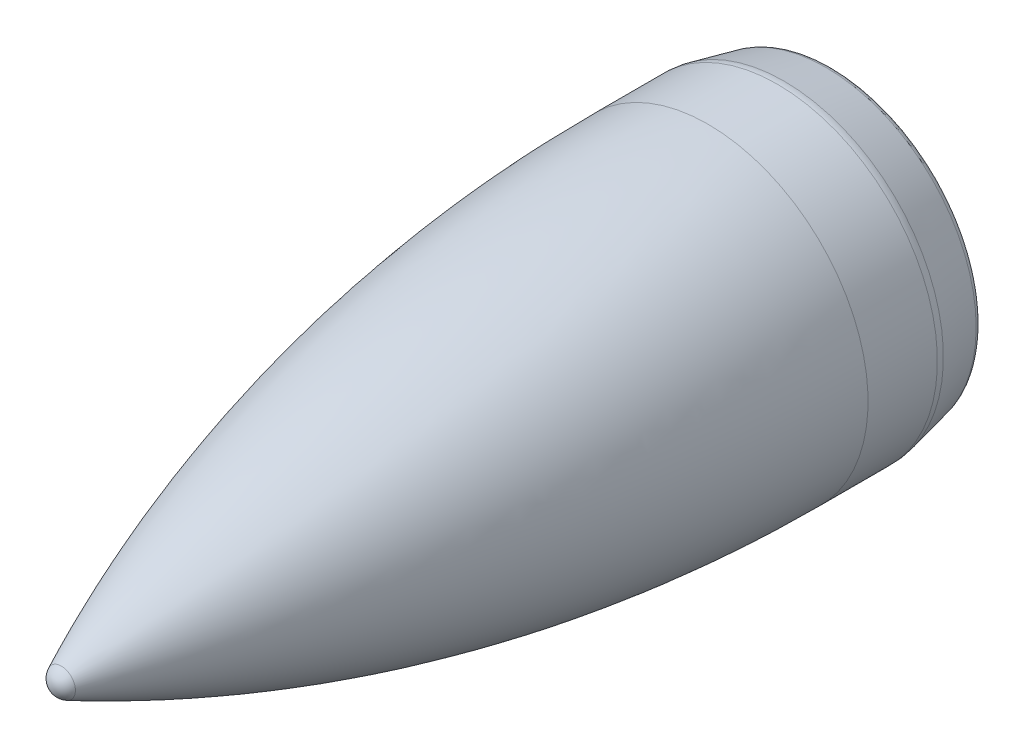
ISO-10303-21;
HEADER;
FILE_DESCRIPTION(('STEP AP214'),'2;1');
FILE_NAME('part.step','',(''),(''),'','','');
FILE_SCHEMA(('AUTOMOTIVE_DESIGN { 1 0 10303 214 1 1 1 1 }'));
ENDSEC;
DATA;
#1=APPLICATION_CONTEXT('core data for automotive mechanical design processes');
#2=APPLICATION_PROTOCOL_DEFINITION('international standard','automotive_design',2000,#1);
#3=PRODUCT_CONTEXT('',#1,'mechanical');
#4=PRODUCT('Part','Part','',(#3));
#5=PRODUCT_RELATED_PRODUCT_CATEGORY('part','',(#4));
#6=PRODUCT_DEFINITION_FORMATION('','',#4);
#7=PRODUCT_DEFINITION_CONTEXT('part definition',#1,'design');
#8=PRODUCT_DEFINITION('design','',#6,#7);
#9=PRODUCT_DEFINITION_SHAPE('','',#8);
#10=(LENGTH_UNIT() NAMED_UNIT(*) SI_UNIT(.MILLI.,.METRE.));
#11=(NAMED_UNIT(*) PLANE_ANGLE_UNIT() SI_UNIT($,.RADIAN.));
#12=(NAMED_UNIT(*) SI_UNIT($,.STERADIAN.) SOLID_ANGLE_UNIT());
#13=UNCERTAINTY_MEASURE_WITH_UNIT(LENGTH_MEASURE(1.E-05),#10,'distance_accuracy_value','');
#14=(GEOMETRIC_REPRESENTATION_CONTEXT(3) GLOBAL_UNCERTAINTY_ASSIGNED_CONTEXT((#13)) GLOBAL_UNIT_ASSIGNED_CONTEXT((#10,
#11,#12)) REPRESENTATION_CONTEXT('',''));
#15=CARTESIAN_POINT('',(0.,0.,0.));
#16=DIRECTION('',(0.,0.,1.));
#17=DIRECTION('',(1.,0.,0.));
#18=AXIS2_PLACEMENT_3D('',#15,#16,#17);
#19=CARTESIAN_POINT('',(0.,3.4669625365838,-3.048));
#20=DIRECTION('',(0.,0.,1.));
#21=DIRECTION('',(0.,-1.,0.));
#22=AXIS2_PLACEMENT_3D('',#19,#20,#21);
#23=PLANE('',#22);
#24=CARTESIAN_POINT('',(0.,0.,-3.048));
#25=DIRECTION('',(0.,0.,1.));
#26=DIRECTION('',(0.,-1.,0.));
#27=AXIS2_PLACEMENT_3D('',#24,#25,#26);
#28=CIRCLE('',#27,3.4669625365838);
#29=CARTESIAN_POINT('',(0.,-3.4669625365838,-3.048));
#30=VERTEX_POINT('',#29);
#31=EDGE_CURVE('E72',#30,#30,#28,.T.);
#32=ORIENTED_EDGE('',*,*,#31,.F.);
#33=EDGE_LOOP('',(#32));
#34=FACE_BOUND('',#33,.T.);
#35=ADVANCED_FACE('F45',(#34),#23,.F.);
#36=CARTESIAN_POINT('',(0.,0.,15.6424081157519));
#37=DIRECTION('',(0.,0.,1.));
#38=DIRECTION('',(0.,1.,0.));
#39=AXIS2_PLACEMENT_3D('',#36,#37,#38);
#40=SPHERICAL_SURFACE('',#39,0.381);
#41=CARTESIAN_POINT('',(0.,0.,15.8060597916501));
#42=DIRECTION('',(0.,0.,1.));
#43=DIRECTION('',(0.,-1.,0.));
#44=AXIS2_PLACEMENT_3D('',#41,#42,#43);
#45=CIRCLE('',#44,0.344062681753926);
#46=CARTESIAN_POINT('',(0.,-0.344062681753928,15.8060597916501));
#47=VERTEX_POINT('',#46);
#48=EDGE_CURVE('E10',#47,#47,#45,.T.);
#49=ORIENTED_EDGE('',*,*,#48,.T.);
#50=EDGE_LOOP('',(#49));
#51=FACE_BOUND('',#50,.T.);
#52=ADVANCED_FACE('F87',(#51),#40,.T.);
#53=CARTESIAN_POINT('',(0.,3.91160000000013,6.05015734739382E-13));
#54=CARTESIAN_POINT('',(0.,3.91160000000013,0.0812817513316196));
#55=CARTESIAN_POINT('',(0.,3.91091466438922,0.243605202599734));
#56=CARTESIAN_POINT('',(0.,3.90783055201546,0.630224140604456));
#57=CARTESIAN_POINT('',(0.,3.89960771190493,0.944858140157725));
#58=CARTESIAN_POINT('',(0.,3.8872727329805,1.37751376906593));
#59=CARTESIAN_POINT('',(0.,3.87083138847377,1.74024603751147));
#60=CARTESIAN_POINT('',(0.,3.85027803492917,2.14364851709325));
#61=CARTESIAN_POINT('',(0.,3.82562704849102,2.52389536090649));
#62=CARTESIAN_POINT('',(0.,3.78967242501598,3.01298358565161));
#63=CARTESIAN_POINT('',(0.,3.73835054552011,3.59163085105274));
#64=CARTESIAN_POINT('',(0.,3.66649915250978,4.2702846931654));
#65=CARTESIAN_POINT('',(0.,3.56810160041941,5.04102824095544));
#66=CARTESIAN_POINT('',(0.,3.45333156468382,5.81121913305999));
#67=CARTESIAN_POINT('',(0.,3.32244170431367,6.57765968896453));
#68=CARTESIAN_POINT('',(0.,3.17517102067353,7.3421115851912));
#69=CARTESIAN_POINT('',(0.,3.01210390037676,8.10228100950946));
#70=CARTESIAN_POINT('',(0.,2.83246443577178,8.86013494284682));
#71=CARTESIAN_POINT('',(0.,2.63772658119155,9.61208743196429));
#72=CARTESIAN_POINT('',(0.,2.42568625628858,10.3628120157683));
#73=CARTESIAN_POINT('',(0.,2.20020738855557,11.1039316440157));
#74=CARTESIAN_POINT('',(0.,1.95518414687195,11.8482353007995));
#75=CARTESIAN_POINT('',(0.,1.70097099452093,12.5738076472831));
#76=CARTESIAN_POINT('',(0.,1.42065083354641,13.3161566754205));
#77=CARTESIAN_POINT('',(0.,1.14325402913666,14.0141635847247));
#78=CARTESIAN_POINT('',(0.,0.857658132748848,14.6816008528812));
#79=CARTESIAN_POINT('',(0.,0.65094490609983,15.1496991334785));
#80=CARTESIAN_POINT('',(0.,0.447397481816125,15.5872122995511));
#81=CARTESIAN_POINT('',(0.,0.378975814642762,15.7326581227743));
#82=CARTESIAN_POINT('',(0.,0.344062681780408,15.8060597915944));
#83=B_SPLINE_CURVE_WITH_KNOTS('',4,(#53,#54,#55,#56,#57,#58,#59,#60,#61,#62,#63,#64,#65,#66,#67,
#68,#69,#70,#71,#72,#73,#74,#75,#76,#77,#78,#79,#80,#81,#82),.UNSPECIFIED.,.F.,.F.,(5,1,1,1,1,1,
1,1,1,1,1,1,1,1,1,1,1,1,1,1,1,1,1,1,1,1,5),(0.0832846360657686,0.103185271976087,
0.123085907886406,0.142986543872432,0.162887179858458,0.182787816535228,0.202688453211998,
0.222589089077083,0.242489724942169,0.282290995036511,0.322092269878615,0.361893549077468,
0.401694812600632,0.441496078337045,0.481297362993973,0.521098634198775,0.560899896884632,
0.600701175601061,0.640502451348722,0.680303710861297,0.720104976164637,0.759906270639483,
0.799707548202696,0.839508792738012,0.879310081738808,0.899210730808644,0.919111379878479),.UNSPECIFIED.);
#84=CARTESIAN_POINT('',(0.,0.,16.0234081157519));
#85=DIRECTION('',(0.,0.,1.));
#86=AXIS1_PLACEMENT('',#84,#85);
#87=SURFACE_OF_REVOLUTION('',#83,#86);
#88=ORIENTED_EDGE('',*,*,#48,.F.);
#89=EDGE_LOOP('',(#88));
#90=FACE_BOUND('',#89,.T.);
#91=CARTESIAN_POINT('',(0.,0.,6.03683769639929E-13));
#92=DIRECTION('',(0.,0.,1.));
#93=DIRECTION('',(0.,-1.,0.));
#94=AXIS2_PLACEMENT_3D('',#91,#92,#93);
#95=CIRCLE('',#94,3.91160000000013);
#96=CARTESIAN_POINT('',(0.,-3.91160000000013,6.0320415807182E-13));
#97=VERTEX_POINT('',#96);
#98=EDGE_CURVE('E52',#97,#97,#95,.T.);
#99=ORIENTED_EDGE('',*,*,#98,.T.);
#100=EDGE_LOOP('',(#99));
#101=FACE_BOUND('',#100,.T.);
#102=ADVANCED_FACE('F83',(#90,#101),#87,.T.);
#103=CARTESIAN_POINT('',(0.,0.,16.0234081157519));
#104=DIRECTION('',(0.,0.,1.));
#105=DIRECTION('',(0.,-1.,0.));
#106=AXIS2_PLACEMENT_3D('',#103,#104,#105);
#107=CYLINDRICAL_SURFACE('',#106,3.91160000000006);
#108=ORIENTED_EDGE('',*,*,#98,.F.);
#109=EDGE_LOOP('',(#108));
#110=FACE_BOUND('',#109,.T.);
#111=CARTESIAN_POINT('',(0.,0.,-1.69454742749737));
#112=DIRECTION('',(0.,0.,1.));
#113=DIRECTION('',(0.,-1.,0.));
#114=AXIS2_PLACEMENT_3D('',#111,#112,#113);
#115=CIRCLE('',#114,3.9116);
#116=CARTESIAN_POINT('',(0.,-3.9116,-1.69454742749737));
#117=VERTEX_POINT('',#116);
#118=EDGE_CURVE('E57',#117,#117,#115,.T.);
#119=ORIENTED_EDGE('',*,*,#118,.T.);
#120=EDGE_LOOP('',(#119));
#121=FACE_BOUND('',#120,.T.);
#122=ADVANCED_FACE('F86',(#110,#121),#107,.T.);
#123=CARTESIAN_POINT('',(0.,0.,-1.69454742749737));
#124=DIRECTION('',(0.,0.,1.));
#125=DIRECTION('',(0.,-1.,0.));
#126=AXIS2_PLACEMENT_3D('',#123,#124,#125);
#127=TOROIDAL_SURFACE('',#126,3.1496,0.762000000000001);
#128=ORIENTED_EDGE('',*,*,#118,.F.);
#129=EDGE_LOOP('',(#128));
#130=FACE_BOUND('',#129,.T.);
#131=CARTESIAN_POINT('',(0.,0.,-1.85947441331821));
#132=DIRECTION('',(0.,0.,1.));
#133=DIRECTION('',(0.,-1.,0.));
#134=AXIS2_PLACEMENT_3D('',#131,#132,#133);
#135=CIRCLE('',#134,3.89353755742539);
#136=CARTESIAN_POINT('',(0.,-3.89353755742539,-1.85947441331821));
#137=VERTEX_POINT('',#136);
#138=EDGE_CURVE('E62',#137,#137,#135,.T.);
#139=ORIENTED_EDGE('',*,*,#138,.T.);
#140=EDGE_LOOP('',(#139));
#141=FACE_BOUND('',#140,.T.);
#142=ADVANCED_FACE('F107',(#130,#141),#127,.T.);
#143=CARTESIAN_POINT('',(0.,0.,-2.88878052955222));
#144=DIRECTION('',(0.,0.,1.));
#145=DIRECTION('',(0.,-1.,0.));
#146=AXIS2_PLACEMENT_3D('',#143,#144,#145);
#147=CONICAL_SURFACE('',#146,3.66534588523057,0.218166156499292);
#148=ORIENTED_EDGE('',*,*,#138,.F.);
#149=EDGE_LOOP('',(#148));
#150=FACE_BOUND('',#149,.T.);
#151=CARTESIAN_POINT('',(0.,0.,-2.88878052955222));
#152=DIRECTION('',(0.,0.,1.));
#153=DIRECTION('',(0.,-1.,0.));
#154=AXIS2_PLACEMENT_3D('',#151,#152,#153);
#155=CIRCLE('',#154,3.66534588523057);
#156=CARTESIAN_POINT('',(0.,-3.66534588523057,-2.88878052955222));
#157=VERTEX_POINT('',#156);
#158=EDGE_CURVE('E68',#157,#157,#155,.T.);
#159=ORIENTED_EDGE('',*,*,#158,.T.);
#160=EDGE_LOOP('',(#159));
#161=FACE_BOUND('',#160,.T.);
#162=ADVANCED_FACE('F101',(#150,#161),#147,.T.);
#163=CARTESIAN_POINT('',(0.,0.,-2.8448));
#164=DIRECTION('',(0.,0.,1.));
#165=DIRECTION('',(0.,-1.,0.));
#166=AXIS2_PLACEMENT_3D('',#163,#164,#165);
#167=TOROIDAL_SURFACE('',#166,3.4669625365838,0.203200000000001);
#168=ORIENTED_EDGE('',*,*,#158,.F.);
#169=EDGE_LOOP('',(#168));
#170=FACE_BOUND('',#169,.T.);
#171=ORIENTED_EDGE('',*,*,#31,.T.);
#172=EDGE_LOOP('',(#171));
#173=FACE_BOUND('',#172,.T.);
#174=ADVANCED_FACE('F99',(#170,#173),#167,.T.);
#175=CLOSED_SHELL('',(#35,#52,#102,#122,#142,#162,#174));
#176=MANIFOLD_SOLID_BREP('B2',#175);
#177=ADVANCED_BREP_SHAPE_REPRESENTATION('',(#18,#176),#14);
#178=SHAPE_DEFINITION_REPRESENTATION(#9,#177);
ENDSEC;
END-ISO-10303-21;
